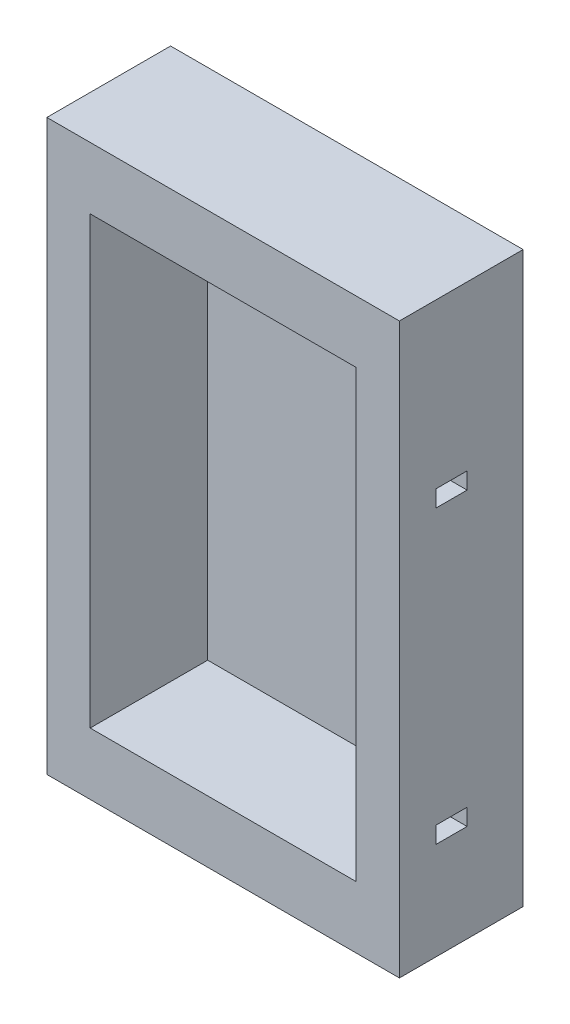
ISO-10303-21;
HEADER;
FILE_DESCRIPTION(('STEP AP214'),'2;1');
FILE_NAME('part.step','',(''),(''),'','','');
FILE_SCHEMA(('AUTOMOTIVE_DESIGN { 1 0 10303 214 1 1 1 1 }'));
ENDSEC;
DATA;
#1=APPLICATION_CONTEXT('core data for automotive mechanical design processes');
#2=APPLICATION_PROTOCOL_DEFINITION('international standard','automotive_design',2000,#1);
#3=PRODUCT_CONTEXT('',#1,'mechanical');
#4=PRODUCT('Part','Part','',(#3));
#5=PRODUCT_RELATED_PRODUCT_CATEGORY('part','',(#4));
#6=PRODUCT_DEFINITION_FORMATION('','',#4);
#7=PRODUCT_DEFINITION_CONTEXT('part definition',#1,'design');
#8=PRODUCT_DEFINITION('design','',#6,#7);
#9=PRODUCT_DEFINITION_SHAPE('','',#8);
#10=(LENGTH_UNIT() NAMED_UNIT(*) SI_UNIT(.MILLI.,.METRE.));
#11=(NAMED_UNIT(*) PLANE_ANGLE_UNIT() SI_UNIT($,.RADIAN.));
#12=(NAMED_UNIT(*) SI_UNIT($,.STERADIAN.) SOLID_ANGLE_UNIT());
#13=UNCERTAINTY_MEASURE_WITH_UNIT(LENGTH_MEASURE(1.E-05),#10,'distance_accuracy_value','');
#14=(GEOMETRIC_REPRESENTATION_CONTEXT(3) GLOBAL_UNCERTAINTY_ASSIGNED_CONTEXT((#13)) GLOBAL_UNIT_ASSIGNED_CONTEXT((#10,
#11,#12)) REPRESENTATION_CONTEXT('',''));
#15=CARTESIAN_POINT('',(0.,0.,0.));
#16=DIRECTION('',(0.,0.,1.));
#17=DIRECTION('',(1.,0.,0.));
#18=AXIS2_PLACEMENT_3D('',#15,#16,#17);
#19=CARTESIAN_POINT('',(-72.39,-116.84,50.8));
#20=DIRECTION('',(1.,0.,0.));
#21=DIRECTION('',(0.,0.,-1.));
#22=AXIS2_PLACEMENT_3D('',#19,#20,#21);
#23=PLANE('',#22);
#24=DIRECTION('',(0.,-1.,0.));
#25=VECTOR('',#24,1.);
#26=CARTESIAN_POINT('',(-72.39,-116.84,0.));
#27=LINE('',#26,#25);
#28=CARTESIAN_POINT('',(-72.39,116.84,0.));
#29=VERTEX_POINT('',#28);
#30=CARTESIAN_POINT('',(-72.39,-116.84,0.));
#31=VERTEX_POINT('',#30);
#32=EDGE_CURVE('E268',#29,#31,#27,.T.);
#33=ORIENTED_EDGE('',*,*,#32,.T.);
#34=DIRECTION('',(0.,0.,-1.));
#35=VECTOR('',#34,1.);
#36=CARTESIAN_POINT('',(-72.39,-116.84,50.8));
#37=LINE('',#36,#35);
#38=CARTESIAN_POINT('',(-72.39,-116.84,50.8));
#39=VERTEX_POINT('',#38);
#40=EDGE_CURVE('E11',#39,#31,#37,.T.);
#41=ORIENTED_EDGE('',*,*,#40,.F.);
#42=DIRECTION('',(0.,-1.,0.));
#43=VECTOR('',#42,1.);
#44=CARTESIAN_POINT('',(-72.39,-116.84,50.8));
#45=LINE('',#44,#43);
#46=CARTESIAN_POINT('',(-72.39,116.84,50.8));
#47=VERTEX_POINT('',#46);
#48=EDGE_CURVE('E278',#47,#39,#45,.T.);
#49=ORIENTED_EDGE('',*,*,#48,.F.);
#50=DIRECTION('',(0.,0.,-1.));
#51=VECTOR('',#50,1.);
#52=CARTESIAN_POINT('',(-72.39,116.84,50.8));
#53=LINE('',#52,#51);
#54=EDGE_CURVE('E292',#47,#29,#53,.T.);
#55=ORIENTED_EDGE('',*,*,#54,.T.);
#56=EDGE_LOOP('',(#33,#41,#49,#55));
#57=FACE_BOUND('',#56,.T.);
#58=ADVANCED_FACE('F41',(#57),#23,.F.);
#59=CARTESIAN_POINT('',(72.39,-116.84,50.8));
#60=DIRECTION('',(0.,1.,0.));
#61=DIRECTION('',(-1.,0.,0.));
#62=AXIS2_PLACEMENT_3D('',#59,#60,#61);
#63=PLANE('',#62);
#64=DIRECTION('',(1.,0.,0.));
#65=VECTOR('',#64,1.);
#66=CARTESIAN_POINT('',(72.39,-116.84,0.));
#67=LINE('',#66,#65);
#68=CARTESIAN_POINT('',(72.39,-116.84,0.));
#69=VERTEX_POINT('',#68);
#70=EDGE_CURVE('E296',#31,#69,#67,.T.);
#71=ORIENTED_EDGE('',*,*,#70,.T.);
#72=DIRECTION('',(0.,0.,-1.));
#73=VECTOR('',#72,1.);
#74=CARTESIAN_POINT('',(72.39,-116.84,50.8));
#75=LINE('',#74,#73);
#76=CARTESIAN_POINT('',(72.39,-116.84,50.8));
#77=VERTEX_POINT('',#76);
#78=EDGE_CURVE('E49',#77,#69,#75,.T.);
#79=ORIENTED_EDGE('',*,*,#78,.F.);
#80=DIRECTION('',(1.,0.,0.));
#81=VECTOR('',#80,1.);
#82=CARTESIAN_POINT('',(72.39,-116.84,50.8));
#83=LINE('',#82,#81);
#84=EDGE_CURVE('E282',#39,#77,#83,.T.);
#85=ORIENTED_EDGE('',*,*,#84,.F.);
#86=ORIENTED_EDGE('',*,*,#40,.T.);
#87=EDGE_LOOP('',(#71,#79,#85,#86));
#88=FACE_BOUND('',#87,.T.);
#89=ADVANCED_FACE('F332',(#88),#63,.F.);
#90=CARTESIAN_POINT('',(72.39,-116.84,50.8));
#91=DIRECTION('',(-1.,0.,0.));
#92=DIRECTION('',(0.,0.,1.));
#93=AXIS2_PLACEMENT_3D('',#90,#91,#92);
#94=PLANE('',#93);
#95=DIRECTION('',(0.,-1.,0.));
#96=VECTOR('',#95,1.);
#97=CARTESIAN_POINT('',(72.39,49.64,35.7));
#98=LINE('',#97,#96);
#99=CARTESIAN_POINT('',(72.39,49.64,35.7));
#100=VERTEX_POINT('',#99);
#101=CARTESIAN_POINT('',(72.39,42.79,35.7));
#102=VERTEX_POINT('',#101);
#103=EDGE_CURVE('E533',#100,#102,#98,.T.);
#104=ORIENTED_EDGE('',*,*,#103,.F.);
#105=DIRECTION('',(0.,0.,1.));
#106=VECTOR('',#105,1.);
#107=CARTESIAN_POINT('',(72.39,49.64,35.7));
#108=LINE('',#107,#106);
#109=CARTESIAN_POINT('',(72.39,49.64,23.));
#110=VERTEX_POINT('',#109);
#111=EDGE_CURVE('E536',#110,#100,#108,.T.);
#112=ORIENTED_EDGE('',*,*,#111,.F.);
#113=DIRECTION('',(0.,1.,0.));
#114=VECTOR('',#113,1.);
#115=CARTESIAN_POINT('',(72.39,49.64,23.));
#116=LINE('',#115,#114);
#117=CARTESIAN_POINT('',(72.39,42.79,23.));
#118=VERTEX_POINT('',#117);
#119=EDGE_CURVE('E181',#118,#110,#116,.T.);
#120=ORIENTED_EDGE('',*,*,#119,.F.);
#121=DIRECTION('',(0.,0.,-1.));
#122=VECTOR('',#121,1.);
#123=CARTESIAN_POINT('',(72.39,42.79,35.7));
#124=LINE('',#123,#122);
#125=EDGE_CURVE('E56',#102,#118,#124,.T.);
#126=ORIENTED_EDGE('',*,*,#125,.F.);
#127=EDGE_LOOP('',(#104,#112,#120,#126));
#128=FACE_BOUND('',#127,.T.);
#129=DIRECTION('',(0.,1.,0.));
#130=VECTOR('',#129,1.);
#131=CARTESIAN_POINT('',(72.39,-69.9899999999999,23.));
#132=LINE('',#131,#130);
#133=CARTESIAN_POINT('',(72.39,-76.8399999999999,23.));
#134=VERTEX_POINT('',#133);
#135=CARTESIAN_POINT('',(72.39,-69.9899999999999,23.));
#136=VERTEX_POINT('',#135);
#137=EDGE_CURVE('E200',#134,#136,#132,.T.);
#138=ORIENTED_EDGE('',*,*,#137,.F.);
#139=DIRECTION('',(0.,0.,-1.));
#140=VECTOR('',#139,1.);
#141=CARTESIAN_POINT('',(72.39,-76.8399999999999,23.));
#142=LINE('',#141,#140);
#143=CARTESIAN_POINT('',(72.39,-76.8399999999999,35.7));
#144=VERTEX_POINT('',#143);
#145=EDGE_CURVE('E204',#144,#134,#142,.T.);
#146=ORIENTED_EDGE('',*,*,#145,.F.);
#147=DIRECTION('',(0.,-1.,0.));
#148=VECTOR('',#147,1.);
#149=CARTESIAN_POINT('',(72.39,-69.9899999999999,35.7));
#150=LINE('',#149,#148);
#151=CARTESIAN_POINT('',(72.39,-69.9899999999999,35.7));
#152=VERTEX_POINT('',#151);
#153=EDGE_CURVE('E208',#152,#144,#150,.T.);
#154=ORIENTED_EDGE('',*,*,#153,.F.);
#155=DIRECTION('',(0.,0.,1.));
#156=VECTOR('',#155,1.);
#157=CARTESIAN_POINT('',(72.39,-69.9899999999999,23.));
#158=LINE('',#157,#156);
#159=EDGE_CURVE('E64',#136,#152,#158,.T.);
#160=ORIENTED_EDGE('',*,*,#159,.F.);
#161=EDGE_LOOP('',(#138,#146,#154,#160));
#162=FACE_BOUND('',#161,.T.);
#163=DIRECTION('',(0.,1.,0.));
#164=VECTOR('',#163,1.);
#165=CARTESIAN_POINT('',(72.39,-116.84,0.));
#166=LINE('',#165,#164);
#167=CARTESIAN_POINT('',(72.39,116.84,0.));
#168=VERTEX_POINT('',#167);
#169=EDGE_CURVE('E299',#69,#168,#166,.T.);
#170=ORIENTED_EDGE('',*,*,#169,.T.);
#171=DIRECTION('',(0.,0.,-1.));
#172=VECTOR('',#171,1.);
#173=CARTESIAN_POINT('',(72.39,116.84,50.8));
#174=LINE('',#173,#172);
#175=CARTESIAN_POINT('',(72.39,116.84,50.8));
#176=VERTEX_POINT('',#175);
#177=EDGE_CURVE('E307',#176,#168,#174,.T.);
#178=ORIENTED_EDGE('',*,*,#177,.F.);
#179=DIRECTION('',(0.,1.,0.));
#180=VECTOR('',#179,1.);
#181=CARTESIAN_POINT('',(72.39,-116.84,50.8));
#182=LINE('',#181,#180);
#183=EDGE_CURVE('E286',#77,#176,#182,.T.);
#184=ORIENTED_EDGE('',*,*,#183,.F.);
#185=ORIENTED_EDGE('',*,*,#78,.T.);
#186=EDGE_LOOP('',(#170,#178,#184,#185));
#187=FACE_BOUND('',#186,.T.);
#188=ADVANCED_FACE('F316',(#128,#162,#187),#94,.F.);
#189=CARTESIAN_POINT('',(72.39,116.84,50.8));
#190=DIRECTION('',(0.,-1.,0.));
#191=DIRECTION('',(1.,0.,0.));
#192=AXIS2_PLACEMENT_3D('',#189,#190,#191);
#193=PLANE('',#192);
#194=DIRECTION('',(-1.,0.,0.));
#195=VECTOR('',#194,1.);
#196=CARTESIAN_POINT('',(72.39,116.84,0.));
#197=LINE('',#196,#195);
#198=EDGE_CURVE('E283',#168,#29,#197,.T.);
#199=ORIENTED_EDGE('',*,*,#198,.T.);
#200=ORIENTED_EDGE('',*,*,#54,.F.);
#201=DIRECTION('',(-1.,0.,0.));
#202=VECTOR('',#201,1.);
#203=CARTESIAN_POINT('',(72.39,116.84,50.8));
#204=LINE('',#203,#202);
#205=EDGE_CURVE('E289',#176,#47,#204,.T.);
#206=ORIENTED_EDGE('',*,*,#205,.F.);
#207=ORIENTED_EDGE('',*,*,#177,.T.);
#208=EDGE_LOOP('',(#199,#200,#206,#207));
#209=FACE_BOUND('',#208,.T.);
#210=ADVANCED_FACE('F325',(#209),#193,.F.);
#211=CARTESIAN_POINT('',(0.,0.,50.8));
#212=DIRECTION('',(0.,0.,1.));
#213=DIRECTION('',(1.,0.,0.));
#214=AXIS2_PLACEMENT_3D('',#211,#212,#213);
#215=PLANE('',#214);
#216=DIRECTION('',(0.,-1.,0.));
#217=VECTOR('',#216,1.);
#218=CARTESIAN_POINT('',(-54.61,-91.44,50.8));
#219=LINE('',#218,#217);
#220=CARTESIAN_POINT('',(-54.61,91.4399999999999,50.8));
#221=VERTEX_POINT('',#220);
#222=CARTESIAN_POINT('',(-54.61,-91.44,50.8));
#223=VERTEX_POINT('',#222);
#224=EDGE_CURVE('E192',#221,#223,#219,.T.);
#225=ORIENTED_EDGE('',*,*,#224,.F.);
#226=DIRECTION('',(-1.,0.,0.));
#227=VECTOR('',#226,1.);
#228=CARTESIAN_POINT('',(54.61,91.44,50.8));
#229=LINE('',#228,#227);
#230=CARTESIAN_POINT('',(54.61,91.44,50.8));
#231=VERTEX_POINT('',#230);
#232=EDGE_CURVE('E239',#231,#221,#229,.T.);
#233=ORIENTED_EDGE('',*,*,#232,.F.);
#234=DIRECTION('',(0.,1.,0.));
#235=VECTOR('',#234,1.);
#236=CARTESIAN_POINT('',(54.61,-91.44,50.8));
#237=LINE('',#236,#235);
#238=CARTESIAN_POINT('',(54.61,-91.44,50.8));
#239=VERTEX_POINT('',#238);
#240=EDGE_CURVE('E258',#239,#231,#237,.T.);
#241=ORIENTED_EDGE('',*,*,#240,.F.);
#242=DIRECTION('',(1.,0.,0.));
#243=VECTOR('',#242,1.);
#244=CARTESIAN_POINT('',(54.61,-91.44,50.8));
#245=LINE('',#244,#243);
#246=EDGE_CURVE('E254',#223,#239,#245,.T.);
#247=ORIENTED_EDGE('',*,*,#246,.F.);
#248=EDGE_LOOP('',(#225,#233,#241,#247));
#249=FACE_BOUND('',#248,.T.);
#250=ORIENTED_EDGE('',*,*,#48,.T.);
#251=ORIENTED_EDGE('',*,*,#84,.T.);
#252=ORIENTED_EDGE('',*,*,#183,.T.);
#253=ORIENTED_EDGE('',*,*,#205,.T.);
#254=EDGE_LOOP('',(#250,#251,#252,#253));
#255=FACE_BOUND('',#254,.T.);
#256=ADVANCED_FACE('F331',(#249,#255),#215,.T.);
#257=CARTESIAN_POINT('',(0.,0.,0.));
#258=DIRECTION('',(0.,0.,1.));
#259=DIRECTION('',(1.,0.,0.));
#260=AXIS2_PLACEMENT_3D('',#257,#258,#259);
#261=PLANE('',#260);
#262=ORIENTED_EDGE('',*,*,#32,.F.);
#263=ORIENTED_EDGE('',*,*,#198,.F.);
#264=ORIENTED_EDGE('',*,*,#169,.F.);
#265=ORIENTED_EDGE('',*,*,#70,.F.);
#266=EDGE_LOOP('',(#262,#263,#264,#265));
#267=FACE_BOUND('',#266,.T.);
#268=ADVANCED_FACE('F322',(#267),#261,.F.);
#269=CARTESIAN_POINT('',(-54.61,-91.44,2.54));
#270=DIRECTION('',(-1.,0.,0.));
#271=DIRECTION('',(0.,0.,1.));
#272=AXIS2_PLACEMENT_3D('',#269,#270,#271);
#273=PLANE('',#272);
#274=ORIENTED_EDGE('',*,*,#224,.T.);
#275=DIRECTION('',(0.,0.,1.));
#276=VECTOR('',#275,1.);
#277=CARTESIAN_POINT('',(-54.61,-91.44,2.54));
#278=LINE('',#277,#276);
#279=CARTESIAN_POINT('',(-54.61,-91.44,2.54));
#280=VERTEX_POINT('',#279);
#281=EDGE_CURVE('E251',#280,#223,#278,.T.);
#282=ORIENTED_EDGE('',*,*,#281,.F.);
#283=DIRECTION('',(0.,-1.,0.));
#284=VECTOR('',#283,1.);
#285=CARTESIAN_POINT('',(-54.61,-91.44,2.54));
#286=LINE('',#285,#284);
#287=CARTESIAN_POINT('',(-54.61,91.4399999999999,2.54));
#288=VERTEX_POINT('',#287);
#289=EDGE_CURVE('E234',#288,#280,#286,.T.);
#290=ORIENTED_EDGE('',*,*,#289,.F.);
#291=DIRECTION('',(0.,0.,1.));
#292=VECTOR('',#291,1.);
#293=CARTESIAN_POINT('',(-54.61,91.4399999999999,2.54));
#294=LINE('',#293,#292);
#295=EDGE_CURVE('E265',#288,#221,#294,.T.);
#296=ORIENTED_EDGE('',*,*,#295,.T.);
#297=EDGE_LOOP('',(#274,#282,#290,#296));
#298=FACE_BOUND('',#297,.T.);
#299=ADVANCED_FACE('F345',(#298),#273,.F.);
#300=CARTESIAN_POINT('',(54.61,91.44,2.54));
#301=DIRECTION('',(0.,1.,0.));
#302=DIRECTION('',(-1.,0.,0.));
#303=AXIS2_PLACEMENT_3D('',#300,#301,#302);
#304=PLANE('',#303);
#305=ORIENTED_EDGE('',*,*,#232,.T.);
#306=ORIENTED_EDGE('',*,*,#295,.F.);
#307=DIRECTION('',(-1.,0.,0.));
#308=VECTOR('',#307,1.);
#309=CARTESIAN_POINT('',(54.61,91.44,2.54));
#310=LINE('',#309,#308);
#311=CARTESIAN_POINT('',(54.61,91.44,2.54));
#312=VERTEX_POINT('',#311);
#313=EDGE_CURVE('E247',#312,#288,#310,.T.);
#314=ORIENTED_EDGE('',*,*,#313,.F.);
#315=DIRECTION('',(0.,0.,1.));
#316=VECTOR('',#315,1.);
#317=CARTESIAN_POINT('',(54.61,91.44,2.54));
#318=LINE('',#317,#316);
#319=EDGE_CURVE('E269',#312,#231,#318,.T.);
#320=ORIENTED_EDGE('',*,*,#319,.T.);
#321=EDGE_LOOP('',(#305,#306,#314,#320));
#322=FACE_BOUND('',#321,.T.);
#323=ADVANCED_FACE('F351',(#322),#304,.F.);
#324=CARTESIAN_POINT('',(54.61,-91.44,2.54));
#325=DIRECTION('',(1.,0.,0.));
#326=DIRECTION('',(0.,0.,-1.));
#327=AXIS2_PLACEMENT_3D('',#324,#325,#326);
#328=PLANE('',#327);
#329=DIRECTION('',(0.,-1.,0.));
#330=VECTOR('',#329,1.);
#331=CARTESIAN_POINT('',(54.61,49.64,23.));
#332=LINE('',#331,#330);
#333=CARTESIAN_POINT('',(54.61,49.64,23.));
#334=VERTEX_POINT('',#333);
#335=CARTESIAN_POINT('',(54.61,42.79,23.));
#336=VERTEX_POINT('',#335);
#337=EDGE_CURVE('E167',#334,#336,#332,.T.);
#338=ORIENTED_EDGE('',*,*,#337,.F.);
#339=DIRECTION('',(0.,0.,-1.));
#340=VECTOR('',#339,1.);
#341=CARTESIAN_POINT('',(54.61,49.64,35.7));
#342=LINE('',#341,#340);
#343=CARTESIAN_POINT('',(54.61,49.64,35.7));
#344=VERTEX_POINT('',#343);
#345=EDGE_CURVE('E172',#344,#334,#342,.T.);
#346=ORIENTED_EDGE('',*,*,#345,.F.);
#347=DIRECTION('',(0.,1.,0.));
#348=VECTOR('',#347,1.);
#349=CARTESIAN_POINT('',(54.61,49.64,35.7));
#350=LINE('',#349,#348);
#351=CARTESIAN_POINT('',(54.61,42.79,35.7));
#352=VERTEX_POINT('',#351);
#353=EDGE_CURVE('E177',#352,#344,#350,.T.);
#354=ORIENTED_EDGE('',*,*,#353,.F.);
#355=DIRECTION('',(0.,0.,1.));
#356=VECTOR('',#355,1.);
#357=CARTESIAN_POINT('',(54.61,42.79,35.7));
#358=LINE('',#357,#356);
#359=EDGE_CURVE('E156',#336,#352,#358,.T.);
#360=ORIENTED_EDGE('',*,*,#359,.F.);
#361=EDGE_LOOP('',(#338,#346,#354,#360));
#362=FACE_BOUND('',#361,.T.);
#363=DIRECTION('',(0.,1.,0.));
#364=VECTOR('',#363,1.);
#365=CARTESIAN_POINT('',(54.61,-69.9899999999999,35.7));
#366=LINE('',#365,#364);
#367=CARTESIAN_POINT('',(54.61,-76.8399999999999,35.7));
#368=VERTEX_POINT('',#367);
#369=CARTESIAN_POINT('',(54.61,-69.9899999999999,35.7));
#370=VERTEX_POINT('',#369);
#371=EDGE_CURVE('E196',#368,#370,#366,.T.);
#372=ORIENTED_EDGE('',*,*,#371,.F.);
#373=DIRECTION('',(0.,0.,1.));
#374=VECTOR('',#373,1.);
#375=CARTESIAN_POINT('',(54.61,-76.8399999999999,23.));
#376=LINE('',#375,#374);
#377=CARTESIAN_POINT('',(54.61,-76.8399999999999,23.));
#378=VERTEX_POINT('',#377);
#379=EDGE_CURVE('E193',#378,#368,#376,.T.);
#380=ORIENTED_EDGE('',*,*,#379,.F.);
#381=DIRECTION('',(0.,-1.,0.));
#382=VECTOR('',#381,1.);
#383=CARTESIAN_POINT('',(54.61,-69.9899999999999,23.));
#384=LINE('',#383,#382);
#385=CARTESIAN_POINT('',(54.61,-69.9899999999999,23.));
#386=VERTEX_POINT('',#385);
#387=EDGE_CURVE('E212',#386,#378,#384,.T.);
#388=ORIENTED_EDGE('',*,*,#387,.F.);
#389=DIRECTION('',(0.,0.,-1.));
#390=VECTOR('',#389,1.);
#391=CARTESIAN_POINT('',(54.61,-69.9899999999999,23.));
#392=LINE('',#391,#390);
#393=EDGE_CURVE('E216',#370,#386,#392,.T.);
#394=ORIENTED_EDGE('',*,*,#393,.F.);
#395=EDGE_LOOP('',(#372,#380,#388,#394));
#396=FACE_BOUND('',#395,.T.);
#397=ORIENTED_EDGE('',*,*,#240,.T.);
#398=ORIENTED_EDGE('',*,*,#319,.F.);
#399=DIRECTION('',(0.,1.,0.));
#400=VECTOR('',#399,1.);
#401=CARTESIAN_POINT('',(54.61,-91.44,2.54));
#402=LINE('',#401,#400);
#403=CARTESIAN_POINT('',(54.61,-91.44,2.54));
#404=VERTEX_POINT('',#403);
#405=EDGE_CURVE('E243',#404,#312,#402,.T.);
#406=ORIENTED_EDGE('',*,*,#405,.F.);
#407=DIRECTION('',(0.,0.,1.));
#408=VECTOR('',#407,1.);
#409=CARTESIAN_POINT('',(54.61,-91.44,2.54));
#410=LINE('',#409,#408);
#411=EDGE_CURVE('E272',#404,#239,#410,.T.);
#412=ORIENTED_EDGE('',*,*,#411,.T.);
#413=EDGE_LOOP('',(#397,#398,#406,#412));
#414=FACE_BOUND('',#413,.T.);
#415=ADVANCED_FACE('F174',(#362,#396,#414),#328,.F.);
#416=CARTESIAN_POINT('',(54.61,-91.44,2.54));
#417=DIRECTION('',(0.,-1.,0.));
#418=DIRECTION('',(1.,0.,0.));
#419=AXIS2_PLACEMENT_3D('',#416,#417,#418);
#420=PLANE('',#419);
#421=ORIENTED_EDGE('',*,*,#246,.T.);
#422=ORIENTED_EDGE('',*,*,#411,.F.);
#423=DIRECTION('',(1.,0.,0.));
#424=VECTOR('',#423,1.);
#425=CARTESIAN_POINT('',(54.61,-91.44,2.54));
#426=LINE('',#425,#424);
#427=EDGE_CURVE('E238',#280,#404,#426,.T.);
#428=ORIENTED_EDGE('',*,*,#427,.F.);
#429=ORIENTED_EDGE('',*,*,#281,.T.);
#430=EDGE_LOOP('',(#421,#422,#428,#429));
#431=FACE_BOUND('',#430,.T.);
#432=ADVANCED_FACE('F353',(#431),#420,.F.);
#433=CARTESIAN_POINT('',(0.,0.,2.54));
#434=DIRECTION('',(0.,0.,1.));
#435=DIRECTION('',(1.,0.,0.));
#436=AXIS2_PLACEMENT_3D('',#433,#434,#435);
#437=PLANE('',#436);
#438=ORIENTED_EDGE('',*,*,#289,.T.);
#439=ORIENTED_EDGE('',*,*,#427,.T.);
#440=ORIENTED_EDGE('',*,*,#405,.T.);
#441=ORIENTED_EDGE('',*,*,#313,.T.);
#442=EDGE_LOOP('',(#438,#439,#440,#441));
#443=FACE_BOUND('',#442,.T.);
#444=ADVANCED_FACE('F356',(#443),#437,.T.);
#445=CARTESIAN_POINT('',(-72.391,-76.8399999999999,23.));
#446=DIRECTION('',(0.,-1.,0.));
#447=DIRECTION('',(0.,0.,-1.));
#448=AXIS2_PLACEMENT_3D('',#445,#446,#447);
#449=PLANE('',#448);
#450=ORIENTED_EDGE('',*,*,#379,.T.);
#451=DIRECTION('',(1.,0.,0.));
#452=VECTOR('',#451,1.);
#453=CARTESIAN_POINT('',(-72.391,-76.8399999999999,35.7));
#454=LINE('',#453,#452);
#455=EDGE_CURVE('E226',#368,#144,#454,.T.);
#456=ORIENTED_EDGE('',*,*,#455,.T.);
#457=ORIENTED_EDGE('',*,*,#145,.T.);
#458=DIRECTION('',(1.,0.,0.));
#459=VECTOR('',#458,1.);
#460=CARTESIAN_POINT('',(-72.391,-76.8399999999999,23.));
#461=LINE('',#460,#459);
#462=EDGE_CURVE('E199',#378,#134,#461,.T.);
#463=ORIENTED_EDGE('',*,*,#462,.F.);
#464=EDGE_LOOP('',(#450,#456,#457,#463));
#465=FACE_BOUND('',#464,.T.);
#466=ADVANCED_FACE('F365',(#465),#449,.F.);
#467=CARTESIAN_POINT('',(-72.391,-69.9899999999999,23.));
#468=DIRECTION('',(0.,0.,-1.));
#469=DIRECTION('',(-1.,0.,0.));
#470=AXIS2_PLACEMENT_3D('',#467,#468,#469);
#471=PLANE('',#470);
#472=ORIENTED_EDGE('',*,*,#387,.T.);
#473=ORIENTED_EDGE('',*,*,#462,.T.);
#474=ORIENTED_EDGE('',*,*,#137,.T.);
#475=DIRECTION('',(1.,0.,0.));
#476=VECTOR('',#475,1.);
#477=CARTESIAN_POINT('',(-72.391,-69.9899999999999,23.));
#478=LINE('',#477,#476);
#479=EDGE_CURVE('E227',#386,#136,#478,.T.);
#480=ORIENTED_EDGE('',*,*,#479,.F.);
#481=EDGE_LOOP('',(#472,#473,#474,#480));
#482=FACE_BOUND('',#481,.T.);
#483=ADVANCED_FACE('F369',(#482),#471,.F.);
#484=CARTESIAN_POINT('',(-72.391,-69.9899999999999,23.));
#485=DIRECTION('',(0.,1.,0.));
#486=DIRECTION('',(0.,0.,1.));
#487=AXIS2_PLACEMENT_3D('',#484,#485,#486);
#488=PLANE('',#487);
#489=ORIENTED_EDGE('',*,*,#393,.T.);
#490=ORIENTED_EDGE('',*,*,#479,.T.);
#491=ORIENTED_EDGE('',*,*,#159,.T.);
#492=DIRECTION('',(1.,0.,0.));
#493=VECTOR('',#492,1.);
#494=CARTESIAN_POINT('',(-72.391,-69.9899999999999,35.7));
#495=LINE('',#494,#493);
#496=EDGE_CURVE('E223',#370,#152,#495,.T.);
#497=ORIENTED_EDGE('',*,*,#496,.F.);
#498=EDGE_LOOP('',(#489,#490,#491,#497));
#499=FACE_BOUND('',#498,.T.);
#500=ADVANCED_FACE('F373',(#499),#488,.F.);
#501=CARTESIAN_POINT('',(-72.391,-69.9899999999999,35.7));
#502=DIRECTION('',(0.,0.,1.));
#503=DIRECTION('',(1.,0.,0.));
#504=AXIS2_PLACEMENT_3D('',#501,#502,#503);
#505=PLANE('',#504);
#506=ORIENTED_EDGE('',*,*,#371,.T.);
#507=ORIENTED_EDGE('',*,*,#496,.T.);
#508=ORIENTED_EDGE('',*,*,#153,.T.);
#509=ORIENTED_EDGE('',*,*,#455,.F.);
#510=EDGE_LOOP('',(#506,#507,#508,#509));
#511=FACE_BOUND('',#510,.T.);
#512=ADVANCED_FACE('F377',(#511),#505,.F.);
#513=CARTESIAN_POINT('',(-72.391,49.64,35.7));
#514=DIRECTION('',(0.,1.,0.));
#515=DIRECTION('',(0.,0.,1.));
#516=AXIS2_PLACEMENT_3D('',#513,#514,#515);
#517=PLANE('',#516);
#518=ORIENTED_EDGE('',*,*,#345,.T.);
#519=DIRECTION('',(1.,0.,0.));
#520=VECTOR('',#519,1.);
#521=CARTESIAN_POINT('',(-72.391,49.64,23.));
#522=LINE('',#521,#520);
#523=EDGE_CURVE('E162',#334,#110,#522,.T.);
#524=ORIENTED_EDGE('',*,*,#523,.T.);
#525=ORIENTED_EDGE('',*,*,#111,.T.);
#526=DIRECTION('',(1.,0.,0.));
#527=VECTOR('',#526,1.);
#528=CARTESIAN_POINT('',(-72.391,49.64,35.7));
#529=LINE('',#528,#527);
#530=EDGE_CURVE('E187',#344,#100,#529,.T.);
#531=ORIENTED_EDGE('',*,*,#530,.F.);
#532=EDGE_LOOP('',(#518,#524,#525,#531));
#533=FACE_BOUND('',#532,.T.);
#534=ADVANCED_FACE('F380',(#533),#517,.F.);
#535=CARTESIAN_POINT('',(-72.391,49.64,35.7));
#536=DIRECTION('',(0.,0.,1.));
#537=DIRECTION('',(1.,0.,0.));
#538=AXIS2_PLACEMENT_3D('',#535,#536,#537);
#539=PLANE('',#538);
#540=ORIENTED_EDGE('',*,*,#353,.T.);
#541=ORIENTED_EDGE('',*,*,#530,.T.);
#542=ORIENTED_EDGE('',*,*,#103,.T.);
#543=DIRECTION('',(1.,0.,0.));
#544=VECTOR('',#543,1.);
#545=CARTESIAN_POINT('',(-72.391,42.79,35.7));
#546=LINE('',#545,#544);
#547=EDGE_CURVE('E163',#352,#102,#546,.T.);
#548=ORIENTED_EDGE('',*,*,#547,.F.);
#549=EDGE_LOOP('',(#540,#541,#542,#548));
#550=FACE_BOUND('',#549,.T.);
#551=ADVANCED_FACE('F384',(#550),#539,.F.);
#552=CARTESIAN_POINT('',(-72.391,42.79,35.7));
#553=DIRECTION('',(0.,-1.,0.));
#554=DIRECTION('',(0.,0.,-1.));
#555=AXIS2_PLACEMENT_3D('',#552,#553,#554);
#556=PLANE('',#555);
#557=ORIENTED_EDGE('',*,*,#359,.T.);
#558=ORIENTED_EDGE('',*,*,#547,.T.);
#559=ORIENTED_EDGE('',*,*,#125,.T.);
#560=DIRECTION('',(1.,0.,0.));
#561=VECTOR('',#560,1.);
#562=CARTESIAN_POINT('',(-72.391,42.79,23.));
#563=LINE('',#562,#561);
#564=EDGE_CURVE('E152',#336,#118,#563,.T.);
#565=ORIENTED_EDGE('',*,*,#564,.F.);
#566=EDGE_LOOP('',(#557,#558,#559,#565));
#567=FACE_BOUND('',#566,.T.);
#568=ADVANCED_FACE('F154',(#567),#556,.F.);
#569=CARTESIAN_POINT('',(-72.391,49.64,23.));
#570=DIRECTION('',(0.,0.,-1.));
#571=DIRECTION('',(0.,1.,0.));
#572=AXIS2_PLACEMENT_3D('',#569,#570,#571);
#573=PLANE('',#572);
#574=ORIENTED_EDGE('',*,*,#337,.T.);
#575=ORIENTED_EDGE('',*,*,#564,.T.);
#576=ORIENTED_EDGE('',*,*,#119,.T.);
#577=ORIENTED_EDGE('',*,*,#523,.F.);
#578=EDGE_LOOP('',(#574,#575,#576,#577));
#579=FACE_BOUND('',#578,.T.);
#580=ADVANCED_FACE('F168',(#579),#573,.F.);
#581=CLOSED_SHELL('',(#58,#89,#188,#210,#256,#268,#299,#323,#415,#432,#444,#466,#483,#500,#512,
#534,#551,#568,#580));
#582=MANIFOLD_SOLID_BREP('B2',#581);
#583=ADVANCED_BREP_SHAPE_REPRESENTATION('',(#18,#582),#14);
#584=SHAPE_DEFINITION_REPRESENTATION(#9,#583);
ENDSEC;
END-ISO-10303-21;
